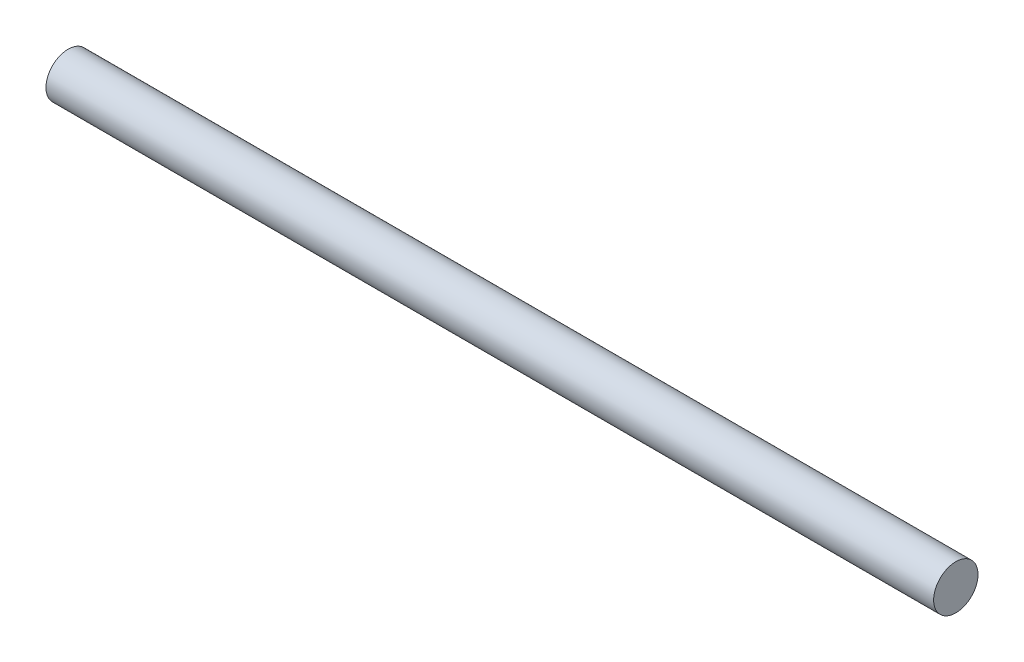
ISO-10303-21;
HEADER;
FILE_DESCRIPTION(('STEP AP214'),'2;1');
FILE_NAME('part.step','',(''),(''),'','','');
FILE_SCHEMA(('AUTOMOTIVE_DESIGN { 1 0 10303 214 1 1 1 1 }'));
ENDSEC;
DATA;
#1=APPLICATION_CONTEXT('core data for automotive mechanical design processes');
#2=APPLICATION_PROTOCOL_DEFINITION('international standard','automotive_design',2000,#1);
#3=PRODUCT_CONTEXT('',#1,'mechanical');
#4=PRODUCT('Part','Part','',(#3));
#5=PRODUCT_RELATED_PRODUCT_CATEGORY('part','',(#4));
#6=PRODUCT_DEFINITION_FORMATION('','',#4);
#7=PRODUCT_DEFINITION_CONTEXT('part definition',#1,'design');
#8=PRODUCT_DEFINITION('design','',#6,#7);
#9=PRODUCT_DEFINITION_SHAPE('','',#8);
#10=(LENGTH_UNIT() NAMED_UNIT(*) SI_UNIT(.MILLI.,.METRE.));
#11=(NAMED_UNIT(*) PLANE_ANGLE_UNIT() SI_UNIT($,.RADIAN.));
#12=(NAMED_UNIT(*) SI_UNIT($,.STERADIAN.) SOLID_ANGLE_UNIT());
#13=UNCERTAINTY_MEASURE_WITH_UNIT(LENGTH_MEASURE(1.E-05),#10,'distance_accuracy_value','');
#14=(GEOMETRIC_REPRESENTATION_CONTEXT(3) GLOBAL_UNCERTAINTY_ASSIGNED_CONTEXT((#13)) GLOBAL_UNIT_ASSIGNED_CONTEXT((#10,
#11,#12)) REPRESENTATION_CONTEXT('',''));
#15=CARTESIAN_POINT('',(0.,0.,0.));
#16=DIRECTION('',(0.,0.,1.));
#17=DIRECTION('',(1.,0.,0.));
#18=AXIS2_PLACEMENT_3D('',#15,#16,#17);
#19=CARTESIAN_POINT('',(80.,0.,0.));
#20=DIRECTION('',(-1.,0.,0.));
#21=DIRECTION('',(0.,0.,1.));
#22=AXIS2_PLACEMENT_3D('',#19,#20,#21);
#23=CYLINDRICAL_SURFACE('',#22,2.);
#24=CARTESIAN_POINT('',(80.,0.,0.));
#25=DIRECTION('',(1.,0.,0.));
#26=DIRECTION('',(0.,0.,-1.));
#27=AXIS2_PLACEMENT_3D('',#24,#25,#26);
#28=CIRCLE('',#27,2.);
#29=CARTESIAN_POINT('',(80.,0.,-2.));
#30=VERTEX_POINT('',#29);
#31=EDGE_CURVE('E10',#30,#30,#28,.T.);
#32=ORIENTED_EDGE('',*,*,#31,.F.);
#33=EDGE_LOOP('',(#32));
#34=FACE_BOUND('',#33,.T.);
#35=CARTESIAN_POINT('',(0.,0.,0.));
#36=DIRECTION('',(1.,0.,0.));
#37=DIRECTION('',(0.,0.,-1.));
#38=AXIS2_PLACEMENT_3D('',#35,#36,#37);
#39=CIRCLE('',#38,2.);
#40=CARTESIAN_POINT('',(0.,0.,-2.));
#41=VERTEX_POINT('',#40);
#42=EDGE_CURVE('E33',#41,#41,#39,.T.);
#43=ORIENTED_EDGE('',*,*,#42,.T.);
#44=EDGE_LOOP('',(#43));
#45=FACE_BOUND('',#44,.T.);
#46=ADVANCED_FACE('F30',(#34,#45),#23,.T.);
#47=CARTESIAN_POINT('',(80.,0.,0.));
#48=DIRECTION('',(1.,0.,0.));
#49=DIRECTION('',(0.,0.,-1.));
#50=AXIS2_PLACEMENT_3D('',#47,#48,#49);
#51=PLANE('',#50);
#52=ORIENTED_EDGE('',*,*,#31,.T.);
#53=EDGE_LOOP('',(#52));
#54=FACE_BOUND('',#53,.T.);
#55=ADVANCED_FACE('F45',(#54),#51,.T.);
#56=CARTESIAN_POINT('',(0.,0.,0.));
#57=DIRECTION('',(1.,0.,0.));
#58=DIRECTION('',(0.,0.,-1.));
#59=AXIS2_PLACEMENT_3D('',#56,#57,#58);
#60=PLANE('',#59);
#61=ORIENTED_EDGE('',*,*,#42,.F.);
#62=EDGE_LOOP('',(#61));
#63=FACE_BOUND('',#62,.T.);
#64=ADVANCED_FACE('F43',(#63),#60,.F.);
#65=CLOSED_SHELL('',(#46,#55,#64));
#66=MANIFOLD_SOLID_BREP('B2',#65);
#67=ADVANCED_BREP_SHAPE_REPRESENTATION('',(#18,#66),#14);
#68=SHAPE_DEFINITION_REPRESENTATION(#9,#67);
ENDSEC;
END-ISO-10303-21;
